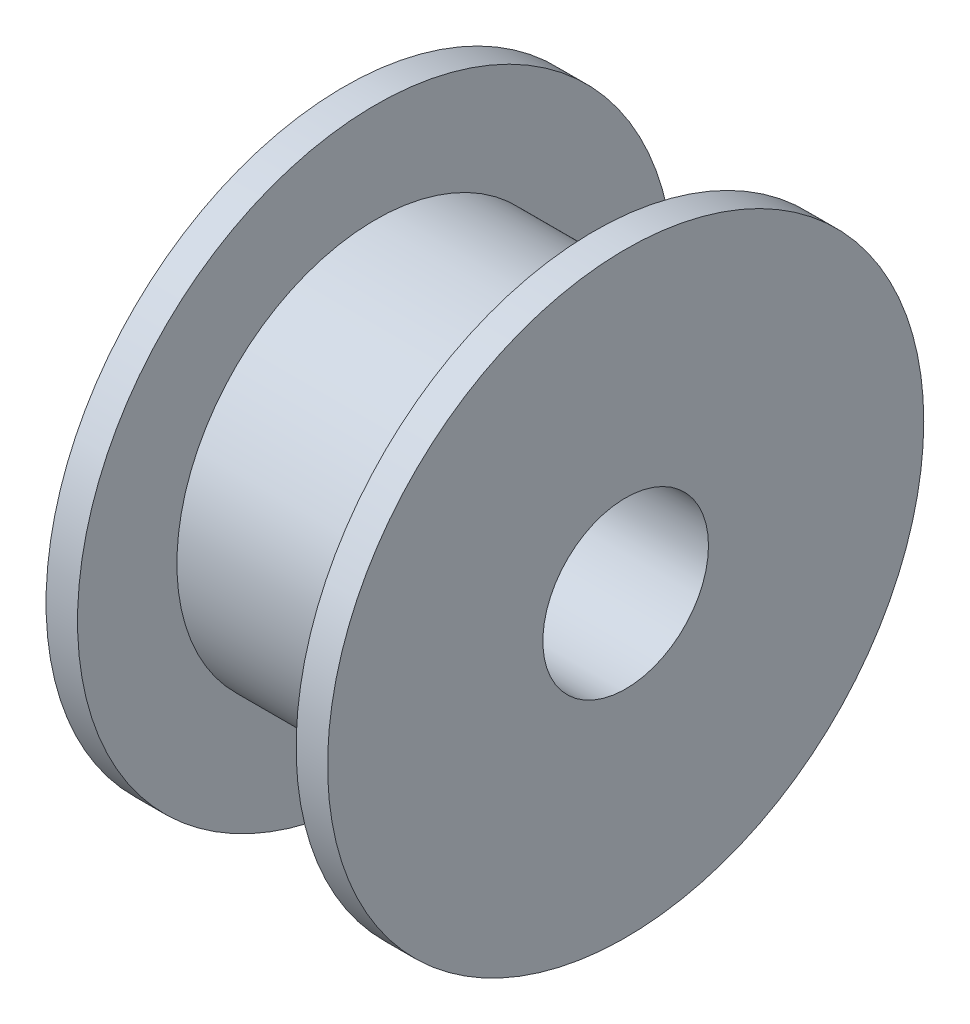
ISO-10303-21;
HEADER;
FILE_DESCRIPTION(('STEP AP214'),'2;1');
FILE_NAME('part.step','',(''),(''),'','','');
FILE_SCHEMA(('AUTOMOTIVE_DESIGN { 1 0 10303 214 1 1 1 1 }'));
ENDSEC;
DATA;
#1=APPLICATION_CONTEXT('core data for automotive mechanical design processes');
#2=APPLICATION_PROTOCOL_DEFINITION('international standard','automotive_design',2000,#1);
#3=PRODUCT_CONTEXT('',#1,'mechanical');
#4=PRODUCT('Part','Part','',(#3));
#5=PRODUCT_RELATED_PRODUCT_CATEGORY('part','',(#4));
#6=PRODUCT_DEFINITION_FORMATION('','',#4);
#7=PRODUCT_DEFINITION_CONTEXT('part definition',#1,'design');
#8=PRODUCT_DEFINITION('design','',#6,#7);
#9=PRODUCT_DEFINITION_SHAPE('','',#8);
#10=(LENGTH_UNIT() NAMED_UNIT(*) SI_UNIT(.MILLI.,.METRE.));
#11=(NAMED_UNIT(*) PLANE_ANGLE_UNIT() SI_UNIT($,.RADIAN.));
#12=(NAMED_UNIT(*) SI_UNIT($,.STERADIAN.) SOLID_ANGLE_UNIT());
#13=UNCERTAINTY_MEASURE_WITH_UNIT(LENGTH_MEASURE(1.E-05),#10,'distance_accuracy_value','');
#14=(GEOMETRIC_REPRESENTATION_CONTEXT(3) GLOBAL_UNCERTAINTY_ASSIGNED_CONTEXT((#13)) GLOBAL_UNIT_ASSIGNED_CONTEXT((#10,
#11,#12)) REPRESENTATION_CONTEXT('',''));
#15=CARTESIAN_POINT('',(0.,0.,0.));
#16=DIRECTION('',(0.,0.,1.));
#17=DIRECTION('',(1.,0.,0.));
#18=AXIS2_PLACEMENT_3D('',#15,#16,#17);
#19=CARTESIAN_POINT('',(0.,0.,0.));
#20=DIRECTION('',(1.,0.,0.));
#21=DIRECTION('',(0.,0.,-1.));
#22=AXIS2_PLACEMENT_3D('',#19,#20,#21);
#23=CYLINDRICAL_SURFACE('',#22,2.5);
#24=CARTESIAN_POINT('',(8.5,0.,0.));
#25=DIRECTION('',(1.,0.,0.));
#26=DIRECTION('',(0.,0.,-1.));
#27=AXIS2_PLACEMENT_3D('',#24,#25,#26);
#28=CIRCLE('',#27,2.5);
#29=CARTESIAN_POINT('',(8.5,0.,-2.5));
#30=VERTEX_POINT('',#29);
#31=EDGE_CURVE('E72',#30,#30,#28,.T.);
#32=ORIENTED_EDGE('',*,*,#31,.T.);
#33=EDGE_LOOP('',(#32));
#34=FACE_BOUND('',#33,.T.);
#35=CARTESIAN_POINT('',(0.,0.,0.));
#36=DIRECTION('',(1.,0.,0.));
#37=DIRECTION('',(0.,0.,-1.));
#38=AXIS2_PLACEMENT_3D('',#35,#36,#37);
#39=CIRCLE('',#38,2.5);
#40=CARTESIAN_POINT('',(0.,0.,-2.5));
#41=VERTEX_POINT('',#40);
#42=EDGE_CURVE('E10',#41,#41,#39,.T.);
#43=ORIENTED_EDGE('',*,*,#42,.F.);
#44=EDGE_LOOP('',(#43));
#45=FACE_BOUND('',#44,.T.);
#46=ADVANCED_FACE('F37',(#34,#45),#23,.F.);
#47=CARTESIAN_POINT('',(0.,2.5,0.));
#48=DIRECTION('',(-1.,0.,0.));
#49=DIRECTION('',(0.,0.,1.));
#50=AXIS2_PLACEMENT_3D('',#47,#48,#49);
#51=PLANE('',#50);
#52=ORIENTED_EDGE('',*,*,#42,.T.);
#53=EDGE_LOOP('',(#52));
#54=FACE_BOUND('',#53,.T.);
#55=CARTESIAN_POINT('',(0.,0.,0.));
#56=DIRECTION('',(1.,0.,0.));
#57=DIRECTION('',(0.,0.,-1.));
#58=AXIS2_PLACEMENT_3D('',#55,#56,#57);
#59=CIRCLE('',#58,9.);
#60=CARTESIAN_POINT('',(0.,0.,-9.));
#61=VERTEX_POINT('',#60);
#62=EDGE_CURVE('E44',#61,#61,#59,.T.);
#63=ORIENTED_EDGE('',*,*,#62,.F.);
#64=EDGE_LOOP('',(#63));
#65=FACE_BOUND('',#64,.T.);
#66=ADVANCED_FACE('F91',(#54,#65),#51,.T.);
#67=CARTESIAN_POINT('',(0.,0.,0.));
#68=DIRECTION('',(1.,0.,0.));
#69=DIRECTION('',(0.,0.,-1.));
#70=AXIS2_PLACEMENT_3D('',#67,#68,#69);
#71=CYLINDRICAL_SURFACE('',#70,9.);
#72=ORIENTED_EDGE('',*,*,#62,.T.);
#73=EDGE_LOOP('',(#72));
#74=FACE_BOUND('',#73,.T.);
#75=CARTESIAN_POINT('',(0.95,0.,0.));
#76=DIRECTION('',(1.,0.,0.));
#77=DIRECTION('',(0.,0.,-1.));
#78=AXIS2_PLACEMENT_3D('',#75,#76,#77);
#79=CIRCLE('',#78,9.);
#80=CARTESIAN_POINT('',(0.95,0.,-9.));
#81=VERTEX_POINT('',#80);
#82=EDGE_CURVE('E49',#81,#81,#79,.T.);
#83=ORIENTED_EDGE('',*,*,#82,.F.);
#84=EDGE_LOOP('',(#83));
#85=FACE_BOUND('',#84,.T.);
#86=ADVANCED_FACE('F95',(#74,#85),#71,.T.);
#87=CARTESIAN_POINT('',(0.95,9.,0.));
#88=DIRECTION('',(1.,0.,0.));
#89=DIRECTION('',(0.,0.,-1.));
#90=AXIS2_PLACEMENT_3D('',#87,#88,#89);
#91=PLANE('',#90);
#92=ORIENTED_EDGE('',*,*,#82,.T.);
#93=EDGE_LOOP('',(#92));
#94=FACE_BOUND('',#93,.T.);
#95=CARTESIAN_POINT('',(0.95,0.,0.));
#96=DIRECTION('',(1.,0.,0.));
#97=DIRECTION('',(0.,0.,-1.));
#98=AXIS2_PLACEMENT_3D('',#95,#96,#97);
#99=CIRCLE('',#98,6.);
#100=CARTESIAN_POINT('',(0.95,0.,-6.));
#101=VERTEX_POINT('',#100);
#102=EDGE_CURVE('E54',#101,#101,#99,.T.);
#103=ORIENTED_EDGE('',*,*,#102,.F.);
#104=EDGE_LOOP('',(#103));
#105=FACE_BOUND('',#104,.T.);
#106=ADVANCED_FACE('F99',(#94,#105),#91,.T.);
#107=CARTESIAN_POINT('',(0.,0.,0.));
#108=DIRECTION('',(1.,0.,0.));
#109=DIRECTION('',(0.,0.,-1.));
#110=AXIS2_PLACEMENT_3D('',#107,#108,#109);
#111=CYLINDRICAL_SURFACE('',#110,6.);
#112=ORIENTED_EDGE('',*,*,#102,.T.);
#113=EDGE_LOOP('',(#112));
#114=FACE_BOUND('',#113,.T.);
#115=CARTESIAN_POINT('',(7.55,0.,0.));
#116=DIRECTION('',(1.,0.,0.));
#117=DIRECTION('',(0.,0.,-1.));
#118=AXIS2_PLACEMENT_3D('',#115,#116,#117);
#119=CIRCLE('',#118,6.);
#120=CARTESIAN_POINT('',(7.55,0.,-6.));
#121=VERTEX_POINT('',#120);
#122=EDGE_CURVE('E60',#121,#121,#119,.T.);
#123=ORIENTED_EDGE('',*,*,#122,.F.);
#124=EDGE_LOOP('',(#123));
#125=FACE_BOUND('',#124,.T.);
#126=ADVANCED_FACE('F105',(#114,#125),#111,.T.);
#127=CARTESIAN_POINT('',(7.55,6.,0.));
#128=DIRECTION('',(-1.,0.,0.));
#129=DIRECTION('',(0.,0.,1.));
#130=AXIS2_PLACEMENT_3D('',#127,#128,#129);
#131=PLANE('',#130);
#132=ORIENTED_EDGE('',*,*,#122,.T.);
#133=EDGE_LOOP('',(#132));
#134=FACE_BOUND('',#133,.T.);
#135=CARTESIAN_POINT('',(7.55,0.,0.));
#136=DIRECTION('',(1.,0.,0.));
#137=DIRECTION('',(0.,0.,-1.));
#138=AXIS2_PLACEMENT_3D('',#135,#136,#137);
#139=CIRCLE('',#138,9.);
#140=CARTESIAN_POINT('',(7.55,0.,-9.));
#141=VERTEX_POINT('',#140);
#142=EDGE_CURVE('E64',#141,#141,#139,.T.);
#143=ORIENTED_EDGE('',*,*,#142,.F.);
#144=EDGE_LOOP('',(#143));
#145=FACE_BOUND('',#144,.T.);
#146=ADVANCED_FACE('F87',(#134,#145),#131,.T.);
#147=CARTESIAN_POINT('',(0.,0.,0.));
#148=DIRECTION('',(1.,0.,0.));
#149=DIRECTION('',(0.,0.,-1.));
#150=AXIS2_PLACEMENT_3D('',#147,#148,#149);
#151=CYLINDRICAL_SURFACE('',#150,9.);
#152=ORIENTED_EDGE('',*,*,#142,.T.);
#153=EDGE_LOOP('',(#152));
#154=FACE_BOUND('',#153,.T.);
#155=CARTESIAN_POINT('',(8.5,0.,0.));
#156=DIRECTION('',(1.,0.,0.));
#157=DIRECTION('',(0.,0.,-1.));
#158=AXIS2_PLACEMENT_3D('',#155,#156,#157);
#159=CIRCLE('',#158,9.);
#160=CARTESIAN_POINT('',(8.5,0.,-9.));
#161=VERTEX_POINT('',#160);
#162=EDGE_CURVE('E68',#161,#161,#159,.T.);
#163=ORIENTED_EDGE('',*,*,#162,.F.);
#164=EDGE_LOOP('',(#163));
#165=FACE_BOUND('',#164,.T.);
#166=ADVANCED_FACE('F81',(#154,#165),#151,.T.);
#167=CARTESIAN_POINT('',(8.5,9.,0.));
#168=DIRECTION('',(1.,0.,0.));
#169=DIRECTION('',(0.,0.,-1.));
#170=AXIS2_PLACEMENT_3D('',#167,#168,#169);
#171=PLANE('',#170);
#172=ORIENTED_EDGE('',*,*,#162,.T.);
#173=EDGE_LOOP('',(#172));
#174=FACE_BOUND('',#173,.T.);
#175=ORIENTED_EDGE('',*,*,#31,.F.);
#176=EDGE_LOOP('',(#175));
#177=FACE_BOUND('',#176,.T.);
#178=ADVANCED_FACE('F79',(#174,#177),#171,.T.);
#179=CLOSED_SHELL('',(#46,#66,#86,#106,#126,#146,#166,#178));
#180=MANIFOLD_SOLID_BREP('B2',#179);
#181=ADVANCED_BREP_SHAPE_REPRESENTATION('',(#18,#180),#14);
#182=SHAPE_DEFINITION_REPRESENTATION(#9,#181);
ENDSEC;
END-ISO-10303-21;
